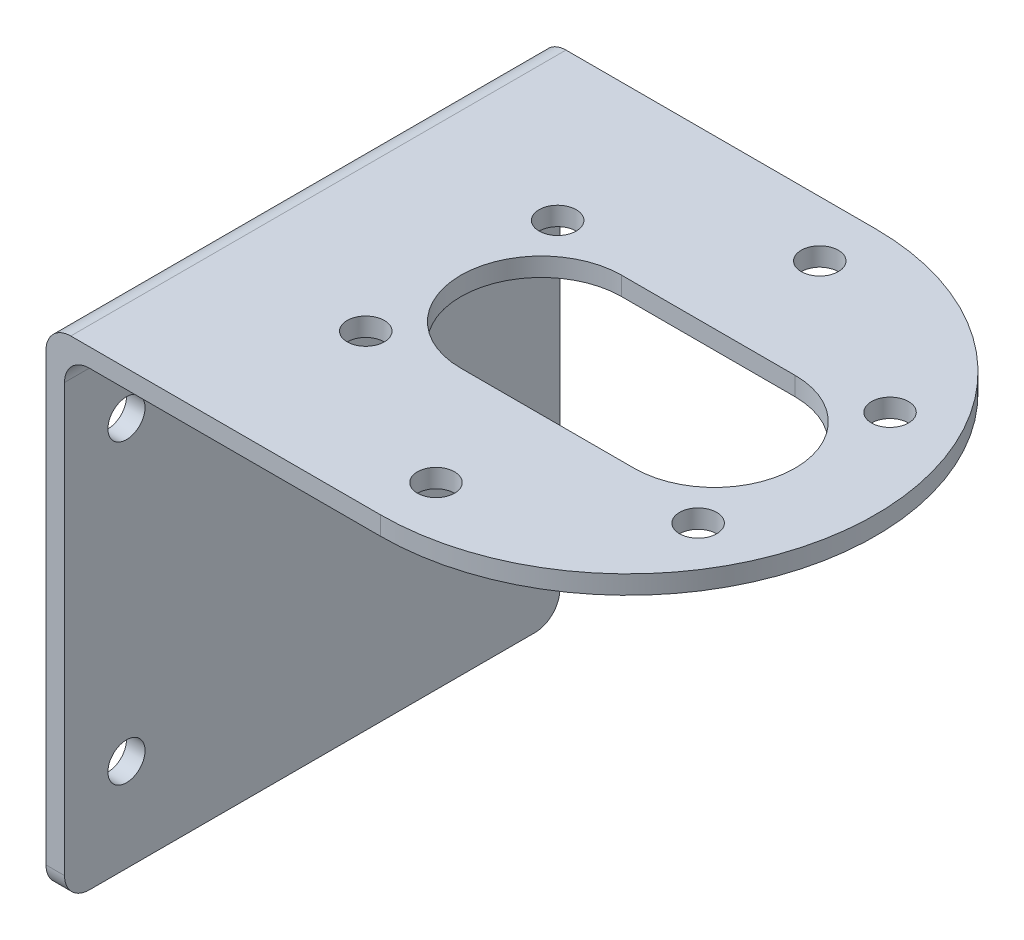
ISO-10303-21;
HEADER;
FILE_DESCRIPTION(('STEP AP214'),'2;1');
FILE_NAME('part.step','',(''),(''),'','','');
FILE_SCHEMA(('AUTOMOTIVE_DESIGN { 1 0 10303 214 1 1 1 1 }'));
ENDSEC;
DATA;
#1=APPLICATION_CONTEXT('core data for automotive mechanical design processes');
#2=APPLICATION_PROTOCOL_DEFINITION('international standard','automotive_design',2000,#1);
#3=PRODUCT_CONTEXT('',#1,'mechanical');
#4=PRODUCT('Part','Part','',(#3));
#5=PRODUCT_RELATED_PRODUCT_CATEGORY('part','',(#4));
#6=PRODUCT_DEFINITION_FORMATION('','',#4);
#7=PRODUCT_DEFINITION_CONTEXT('part definition',#1,'design');
#8=PRODUCT_DEFINITION('design','',#6,#7);
#9=PRODUCT_DEFINITION_SHAPE('','',#8);
#10=(LENGTH_UNIT() NAMED_UNIT(*) SI_UNIT(.MILLI.,.METRE.));
#11=(NAMED_UNIT(*) PLANE_ANGLE_UNIT() SI_UNIT($,.RADIAN.));
#12=(NAMED_UNIT(*) SI_UNIT($,.STERADIAN.) SOLID_ANGLE_UNIT());
#13=UNCERTAINTY_MEASURE_WITH_UNIT(LENGTH_MEASURE(1.E-05),#10,'distance_accuracy_value','');
#14=(GEOMETRIC_REPRESENTATION_CONTEXT(3) GLOBAL_UNCERTAINTY_ASSIGNED_CONTEXT((#13)) GLOBAL_UNIT_ASSIGNED_CONTEXT((#10,
#11,#12)) REPRESENTATION_CONTEXT('',''));
#15=CARTESIAN_POINT('',(0.,0.,0.));
#16=DIRECTION('',(0.,0.,1.));
#17=DIRECTION('',(1.,0.,0.));
#18=AXIS2_PLACEMENT_3D('',#15,#16,#17);
#19=CARTESIAN_POINT('',(3.5,-3.5,20.));
#20=DIRECTION('',(0.,0.,-1.));
#21=DIRECTION('',(-1.,0.,0.));
#22=AXIS2_PLACEMENT_3D('',#19,#20,#21);
#23=CYLINDRICAL_SURFACE('',#22,2.);
#24=CARTESIAN_POINT('',(3.5,-3.5,-20.));
#25=DIRECTION('',(0.,0.,-1.));
#26=DIRECTION('',(-1.,0.,0.));
#27=AXIS2_PLACEMENT_3D('',#24,#25,#26);
#28=CIRCLE('',#27,2.);
#29=CARTESIAN_POINT('',(1.5,-3.5,-20.));
#30=VERTEX_POINT('',#29);
#31=CARTESIAN_POINT('',(3.5,-1.5,-20.));
#32=VERTEX_POINT('',#31);
#33=EDGE_CURVE('E180',#30,#32,#28,.T.);
#34=ORIENTED_EDGE('',*,*,#33,.T.);
#35=DIRECTION('',(0.,0.,-1.));
#36=VECTOR('',#35,1.);
#37=CARTESIAN_POINT('',(3.5,-1.5,20.));
#38=LINE('',#37,#36);
#39=CARTESIAN_POINT('',(3.5,-1.5,20.));
#40=VERTEX_POINT('',#39);
#41=EDGE_CURVE('E226',#40,#32,#38,.T.);
#42=ORIENTED_EDGE('',*,*,#41,.F.);
#43=CARTESIAN_POINT('',(3.5,-3.5,20.));
#44=DIRECTION('',(0.,0.,-1.));
#45=DIRECTION('',(-1.,0.,0.));
#46=AXIS2_PLACEMENT_3D('',#43,#44,#45);
#47=CIRCLE('',#46,2.);
#48=CARTESIAN_POINT('',(1.5,-3.5,20.));
#49=VERTEX_POINT('',#48);
#50=EDGE_CURVE('E181',#49,#40,#47,.T.);
#51=ORIENTED_EDGE('',*,*,#50,.F.);
#52=DIRECTION('',(0.,0.,-1.));
#53=VECTOR('',#52,1.);
#54=CARTESIAN_POINT('',(1.5,-3.5,20.));
#55=LINE('',#54,#53);
#56=EDGE_CURVE('E198',#49,#30,#55,.T.);
#57=ORIENTED_EDGE('',*,*,#56,.T.);
#58=EDGE_LOOP('',(#34,#42,#51,#57));
#59=FACE_BOUND('',#58,.T.);
#60=ADVANCED_FACE('F34',(#59),#23,.F.);
#61=CARTESIAN_POINT('',(3.5,-1.5,20.));
#62=DIRECTION('',(0.,1.,0.));
#63=DIRECTION('',(0.,0.,1.));
#64=AXIS2_PLACEMENT_3D('',#61,#62,#63);
#65=PLANE('',#64);
#66=CARTESIAN_POINT('',(40.4233937586587,-1.5,-7.75000000000016));
#67=DIRECTION('',(0.,-1.,0.));
#68=DIRECTION('',(0.866025403784433,0.,-0.50000000000001));
#69=AXIS2_PLACEMENT_3D('',#66,#67,#68);
#70=CIRCLE('',#69,1.5);
#71=CARTESIAN_POINT('',(41.7224318643354,-1.5,-8.50000000000018));
#72=VERTEX_POINT('',#71);
#73=EDGE_CURVE('E293',#72,#72,#70,.T.);
#74=ORIENTED_EDGE('',*,*,#73,.F.);
#75=EDGE_LOOP('',(#74));
#76=FACE_BOUND('',#75,.T.);
#77=CARTESIAN_POINT('',(40.4233937586589,-1.5,7.74999999999987));
#78=DIRECTION('',(0.,-1.,0.));
#79=DIRECTION('',(0.866025403784443,0.,0.499999999999992));
#80=AXIS2_PLACEMENT_3D('',#77,#78,#79);
#81=CIRCLE('',#80,1.5);
#82=CARTESIAN_POINT('',(41.7224318643355,-1.5,8.49999999999986));
#83=VERTEX_POINT('',#82);
#84=EDGE_CURVE('E283',#83,#83,#81,.T.);
#85=ORIENTED_EDGE('',*,*,#84,.F.);
#86=EDGE_LOOP('',(#85));
#87=FACE_BOUND('',#86,.T.);
#88=CARTESIAN_POINT('',(27.,-1.5,15.5));
#89=DIRECTION('',(0.,-1.,0.));
#90=DIRECTION('',(0.,0.,1.));
#91=AXIS2_PLACEMENT_3D('',#88,#89,#90);
#92=CIRCLE('',#91,1.5);
#93=CARTESIAN_POINT('',(27.,-1.5,17.));
#94=VERTEX_POINT('',#93);
#95=EDGE_CURVE('E280',#94,#94,#92,.T.);
#96=ORIENTED_EDGE('',*,*,#95,.F.);
#97=EDGE_LOOP('',(#96));
#98=FACE_BOUND('',#97,.T.);
#99=CARTESIAN_POINT('',(13.5766062413412,-1.5,7.75000000000007));
#100=DIRECTION('',(0.,-1.,0.));
#101=DIRECTION('',(-0.866025403784436,0.,0.500000000000004));
#102=AXIS2_PLACEMENT_3D('',#99,#100,#101);
#103=CIRCLE('',#102,1.5);
#104=CARTESIAN_POINT('',(12.2775681356646,-1.5,8.50000000000007));
#105=VERTEX_POINT('',#104);
#106=EDGE_CURVE('E277',#105,#105,#103,.T.);
#107=ORIENTED_EDGE('',*,*,#106,.F.);
#108=EDGE_LOOP('',(#107));
#109=FACE_BOUND('',#108,.T.);
#110=CARTESIAN_POINT('',(13.5766062413412,-1.5,-7.74999999999997));
#111=DIRECTION('',(0.,-1.,0.));
#112=DIRECTION('',(-0.86602540378444,0.,-0.499999999999998));
#113=AXIS2_PLACEMENT_3D('',#110,#111,#112);
#114=CIRCLE('',#113,1.5);
#115=CARTESIAN_POINT('',(12.2775681356645,-1.5,-8.49999999999996));
#116=VERTEX_POINT('',#115);
#117=EDGE_CURVE('E273',#116,#116,#114,.T.);
#118=ORIENTED_EDGE('',*,*,#117,.F.);
#119=EDGE_LOOP('',(#118));
#120=FACE_BOUND('',#119,.T.);
#121=CARTESIAN_POINT('',(27.,-1.5,-15.5));
#122=DIRECTION('',(0.,-1.,0.));
#123=DIRECTION('',(0.,0.,-1.));
#124=AXIS2_PLACEMENT_3D('',#121,#122,#123);
#125=CIRCLE('',#124,1.5);
#126=CARTESIAN_POINT('',(27.,-1.5,-17.));
#127=VERTEX_POINT('',#126);
#128=EDGE_CURVE('E242',#127,#127,#125,.T.);
#129=ORIENTED_EDGE('',*,*,#128,.F.);
#130=EDGE_LOOP('',(#129));
#131=FACE_BOUND('',#130,.T.);
#132=DIRECTION('',(-1.,0.,0.));
#133=VECTOR('',#132,1.);
#134=CARTESIAN_POINT('',(34.,-1.5,6.5));
#135=LINE('',#134,#133);
#136=CARTESIAN_POINT('',(34.,-1.5,6.5));
#137=VERTEX_POINT('',#136);
#138=CARTESIAN_POINT('',(20.,-1.5,6.5));
#139=VERTEX_POINT('',#138);
#140=EDGE_CURVE('E155',#137,#139,#135,.T.);
#141=ORIENTED_EDGE('',*,*,#140,.F.);
#142=CARTESIAN_POINT('',(34.,-1.5,0.));
#143=DIRECTION('',(0.,-1.,0.));
#144=DIRECTION('',(0.,0.,-1.));
#145=AXIS2_PLACEMENT_3D('',#142,#143,#144);
#146=CIRCLE('',#145,6.5);
#147=CARTESIAN_POINT('',(34.,-1.5,-6.5));
#148=VERTEX_POINT('',#147);
#149=EDGE_CURVE('E160',#148,#137,#146,.T.);
#150=ORIENTED_EDGE('',*,*,#149,.F.);
#151=DIRECTION('',(1.,0.,0.));
#152=VECTOR('',#151,1.);
#153=CARTESIAN_POINT('',(34.,-1.5,-6.5));
#154=LINE('',#153,#152);
#155=CARTESIAN_POINT('',(20.,-1.5,-6.5));
#156=VERTEX_POINT('',#155);
#157=EDGE_CURVE('E165',#156,#148,#154,.T.);
#158=ORIENTED_EDGE('',*,*,#157,.F.);
#159=CARTESIAN_POINT('',(20.,-1.5,0.));
#160=DIRECTION('',(0.,-1.,0.));
#161=DIRECTION('',(0.,0.,-1.));
#162=AXIS2_PLACEMENT_3D('',#159,#160,#161);
#163=CIRCLE('',#162,6.5);
#164=EDGE_CURVE('E144',#139,#156,#163,.T.);
#165=ORIENTED_EDGE('',*,*,#164,.F.);
#166=EDGE_LOOP('',(#141,#150,#158,#165));
#167=FACE_BOUND('',#166,.T.);
#168=DIRECTION('',(1.,0.,0.));
#169=VECTOR('',#168,1.);
#170=CARTESIAN_POINT('',(3.5,-1.5,-20.));
#171=LINE('',#170,#169);
#172=CARTESIAN_POINT('',(27.,-1.5,-20.));
#173=VERTEX_POINT('',#172);
#174=EDGE_CURVE('E201',#32,#173,#171,.T.);
#175=ORIENTED_EDGE('',*,*,#174,.T.);
#176=CARTESIAN_POINT('',(27.,-1.5,0.));
#177=DIRECTION('',(0.,1.,0.));
#178=DIRECTION('',(0.,0.,1.));
#179=AXIS2_PLACEMENT_3D('',#176,#177,#178);
#180=CIRCLE('',#179,20.);
#181=CARTESIAN_POINT('',(27.,-1.5,20.));
#182=VERTEX_POINT('',#181);
#183=EDGE_CURVE('E172',#182,#173,#180,.T.);
#184=ORIENTED_EDGE('',*,*,#183,.F.);
#185=DIRECTION('',(1.,0.,0.));
#186=VECTOR('',#185,1.);
#187=CARTESIAN_POINT('',(3.5,-1.5,20.));
#188=LINE('',#187,#186);
#189=EDGE_CURVE('E184',#40,#182,#188,.T.);
#190=ORIENTED_EDGE('',*,*,#189,.F.);
#191=ORIENTED_EDGE('',*,*,#41,.T.);
#192=EDGE_LOOP('',(#175,#184,#190,#191));
#193=FACE_BOUND('',#192,.T.);
#194=ADVANCED_FACE('F162',(#76,#87,#98,#109,#120,#131,#167,#193),#65,.F.);
#195=CARTESIAN_POINT('',(2.00000000000001,0.,20.));
#196=DIRECTION('',(0.,1.,0.));
#197=DIRECTION('',(0.,0.,1.));
#198=AXIS2_PLACEMENT_3D('',#195,#196,#197);
#199=PLANE('',#198);
#200=CARTESIAN_POINT('',(40.4233937586587,0.,-7.75000000000016));
#201=DIRECTION('',(0.,1.,0.));
#202=DIRECTION('',(0.,0.,1.));
#203=AXIS2_PLACEMENT_3D('',#200,#201,#202);
#204=CIRCLE('',#203,1.5);
#205=CARTESIAN_POINT('',(40.4233937586587,0.,-6.25000000000016));
#206=VERTEX_POINT('',#205);
#207=EDGE_CURVE('E38',#206,#206,#204,.T.);
#208=ORIENTED_EDGE('',*,*,#207,.F.);
#209=EDGE_LOOP('',(#208));
#210=FACE_BOUND('',#209,.T.);
#211=CARTESIAN_POINT('',(40.4233937586589,0.,7.74999999999987));
#212=DIRECTION('',(0.,1.,0.));
#213=DIRECTION('',(0.,0.,1.));
#214=AXIS2_PLACEMENT_3D('',#211,#212,#213);
#215=CIRCLE('',#214,1.5);
#216=CARTESIAN_POINT('',(40.4233937586589,0.,9.24999999999987));
#217=VERTEX_POINT('',#216);
#218=EDGE_CURVE('E281',#217,#217,#215,.T.);
#219=ORIENTED_EDGE('',*,*,#218,.F.);
#220=EDGE_LOOP('',(#219));
#221=FACE_BOUND('',#220,.T.);
#222=CARTESIAN_POINT('',(27.,0.,15.5));
#223=DIRECTION('',(0.,1.,0.));
#224=DIRECTION('',(0.,0.,1.));
#225=AXIS2_PLACEMENT_3D('',#222,#223,#224);
#226=CIRCLE('',#225,1.5);
#227=CARTESIAN_POINT('',(27.,0.,17.));
#228=VERTEX_POINT('',#227);
#229=EDGE_CURVE('E278',#228,#228,#226,.T.);
#230=ORIENTED_EDGE('',*,*,#229,.F.);
#231=EDGE_LOOP('',(#230));
#232=FACE_BOUND('',#231,.T.);
#233=CARTESIAN_POINT('',(13.5766062413412,0.,7.75000000000007));
#234=DIRECTION('',(0.,1.,0.));
#235=DIRECTION('',(0.,0.,1.));
#236=AXIS2_PLACEMENT_3D('',#233,#234,#235);
#237=CIRCLE('',#236,1.5);
#238=CARTESIAN_POINT('',(13.5766062413412,0.,9.25000000000007));
#239=VERTEX_POINT('',#238);
#240=EDGE_CURVE('E274',#239,#239,#237,.T.);
#241=ORIENTED_EDGE('',*,*,#240,.F.);
#242=EDGE_LOOP('',(#241));
#243=FACE_BOUND('',#242,.T.);
#244=CARTESIAN_POINT('',(13.5766062413412,0.,-7.74999999999997));
#245=DIRECTION('',(0.,1.,0.));
#246=DIRECTION('',(0.,0.,1.));
#247=AXIS2_PLACEMENT_3D('',#244,#245,#246);
#248=CIRCLE('',#247,1.5);
#249=CARTESIAN_POINT('',(13.5766062413412,0.,-6.24999999999996));
#250=VERTEX_POINT('',#249);
#251=EDGE_CURVE('E270',#250,#250,#248,.T.);
#252=ORIENTED_EDGE('',*,*,#251,.F.);
#253=EDGE_LOOP('',(#252));
#254=FACE_BOUND('',#253,.T.);
#255=CARTESIAN_POINT('',(27.,0.,-15.5));
#256=DIRECTION('',(0.,1.,0.));
#257=DIRECTION('',(0.,0.,1.));
#258=AXIS2_PLACEMENT_3D('',#255,#256,#257);
#259=CIRCLE('',#258,1.5);
#260=CARTESIAN_POINT('',(27.,0.,-14.));
#261=VERTEX_POINT('',#260);
#262=EDGE_CURVE('E239',#261,#261,#259,.T.);
#263=ORIENTED_EDGE('',*,*,#262,.F.);
#264=EDGE_LOOP('',(#263));
#265=FACE_BOUND('',#264,.T.);
#266=CARTESIAN_POINT('',(34.,0.,0.));
#267=DIRECTION('',(0.,1.,0.));
#268=DIRECTION('',(0.,0.,1.));
#269=AXIS2_PLACEMENT_3D('',#266,#267,#268);
#270=CIRCLE('',#269,6.5);
#271=CARTESIAN_POINT('',(34.,0.,6.5));
#272=VERTEX_POINT('',#271);
#273=CARTESIAN_POINT('',(34.,0.,-6.5));
#274=VERTEX_POINT('',#273);
#275=EDGE_CURVE('E236',#272,#274,#270,.T.);
#276=ORIENTED_EDGE('',*,*,#275,.F.);
#277=DIRECTION('',(1.,0.,0.));
#278=VECTOR('',#277,1.);
#279=CARTESIAN_POINT('',(2.00000000000002,0.,6.5));
#280=LINE('',#279,#278);
#281=CARTESIAN_POINT('',(20.,0.,6.5));
#282=VERTEX_POINT('',#281);
#283=EDGE_CURVE('E231',#282,#272,#280,.T.);
#284=ORIENTED_EDGE('',*,*,#283,.F.);
#285=CARTESIAN_POINT('',(20.,0.,0.));
#286=DIRECTION('',(0.,1.,0.));
#287=DIRECTION('',(0.,0.,1.));
#288=AXIS2_PLACEMENT_3D('',#285,#286,#287);
#289=CIRCLE('',#288,6.5);
#290=CARTESIAN_POINT('',(20.,0.,-6.5));
#291=VERTEX_POINT('',#290);
#292=EDGE_CURVE('E147',#291,#282,#289,.T.);
#293=ORIENTED_EDGE('',*,*,#292,.F.);
#294=DIRECTION('',(-1.,0.,0.));
#295=VECTOR('',#294,1.);
#296=CARTESIAN_POINT('',(2.00000000000002,0.,-6.5));
#297=LINE('',#296,#295);
#298=EDGE_CURVE('E234',#274,#291,#297,.T.);
#299=ORIENTED_EDGE('',*,*,#298,.F.);
#300=EDGE_LOOP('',(#276,#284,#293,#299));
#301=FACE_BOUND('',#300,.T.);
#302=CARTESIAN_POINT('',(27.,0.,0.));
#303=DIRECTION('',(0.,1.,0.));
#304=DIRECTION('',(0.,0.,1.));
#305=AXIS2_PLACEMENT_3D('',#302,#303,#304);
#306=CIRCLE('',#305,20.);
#307=CARTESIAN_POINT('',(27.,0.,-20.));
#308=VERTEX_POINT('',#307);
#309=CARTESIAN_POINT('',(27.,0.,20.));
#310=VERTEX_POINT('',#309);
#311=EDGE_CURVE('E178',#308,#310,#306,.F.);
#312=ORIENTED_EDGE('',*,*,#311,.F.);
#313=DIRECTION('',(1.,0.,0.));
#314=VECTOR('',#313,1.);
#315=CARTESIAN_POINT('',(2.00000000000001,0.,-20.));
#316=LINE('',#315,#314);
#317=CARTESIAN_POINT('',(2.00000000000001,0.,-20.));
#318=VERTEX_POINT('',#317);
#319=EDGE_CURVE('E204',#318,#308,#316,.T.);
#320=ORIENTED_EDGE('',*,*,#319,.F.);
#321=DIRECTION('',(0.,0.,-1.));
#322=VECTOR('',#321,1.);
#323=CARTESIAN_POINT('',(2.00000000000001,0.,20.));
#324=LINE('',#323,#322);
#325=CARTESIAN_POINT('',(2.00000000000001,0.,20.));
#326=VERTEX_POINT('',#325);
#327=EDGE_CURVE('E224',#326,#318,#324,.T.);
#328=ORIENTED_EDGE('',*,*,#327,.F.);
#329=DIRECTION('',(1.,0.,0.));
#330=VECTOR('',#329,1.);
#331=CARTESIAN_POINT('',(2.00000000000001,0.,20.));
#332=LINE('',#331,#330);
#333=EDGE_CURVE('E188',#326,#310,#332,.T.);
#334=ORIENTED_EDGE('',*,*,#333,.T.);
#335=EDGE_LOOP('',(#312,#320,#328,#334));
#336=FACE_BOUND('',#335,.T.);
#337=ADVANCED_FACE('F317',(#210,#221,#232,#243,#254,#265,#301,#336),#199,.T.);
#338=CARTESIAN_POINT('',(2.,-2.,20.));
#339=DIRECTION('',(0.,0.,-1.));
#340=DIRECTION('',(-1.,0.,0.));
#341=AXIS2_PLACEMENT_3D('',#338,#339,#340);
#342=CYLINDRICAL_SURFACE('',#341,2.);
#343=CARTESIAN_POINT('',(2.,-2.,-20.));
#344=DIRECTION('',(0.,0.,-1.));
#345=DIRECTION('',(-1.,0.,0.));
#346=AXIS2_PLACEMENT_3D('',#343,#344,#345);
#347=CIRCLE('',#346,2.);
#348=CARTESIAN_POINT('',(0.,-2.00000000000001,-20.));
#349=VERTEX_POINT('',#348);
#350=EDGE_CURVE('E207',#349,#318,#347,.T.);
#351=ORIENTED_EDGE('',*,*,#350,.F.);
#352=DIRECTION('',(0.,0.,-1.));
#353=VECTOR('',#352,1.);
#354=CARTESIAN_POINT('',(0.,-2.00000000000001,20.));
#355=LINE('',#354,#353);
#356=CARTESIAN_POINT('',(0.,-2.00000000000001,20.));
#357=VERTEX_POINT('',#356);
#358=EDGE_CURVE('E221',#357,#349,#355,.T.);
#359=ORIENTED_EDGE('',*,*,#358,.F.);
#360=CARTESIAN_POINT('',(2.,-2.,20.));
#361=DIRECTION('',(0.,0.,-1.));
#362=DIRECTION('',(-1.,0.,0.));
#363=AXIS2_PLACEMENT_3D('',#360,#361,#362);
#364=CIRCLE('',#363,2.);
#365=EDGE_CURVE('E191',#357,#326,#364,.T.);
#366=ORIENTED_EDGE('',*,*,#365,.T.);
#367=ORIENTED_EDGE('',*,*,#327,.T.);
#368=EDGE_LOOP('',(#351,#359,#366,#367));
#369=FACE_BOUND('',#368,.T.);
#370=ADVANCED_FACE('F320',(#369),#342,.T.);
#371=CARTESIAN_POINT('',(0.,-40.,20.));
#372=DIRECTION('',(-1.,0.,0.));
#373=DIRECTION('',(0.,0.,1.));
#374=AXIS2_PLACEMENT_3D('',#371,#372,#373);
#375=PLANE('',#374);
#376=CARTESIAN_POINT('',(0.,-8.5,-15.));
#377=DIRECTION('',(-1.,0.,0.));
#378=DIRECTION('',(0.,0.,-1.));
#379=AXIS2_PLACEMENT_3D('',#376,#377,#378);
#380=CIRCLE('',#379,1.49999999999999);
#381=CARTESIAN_POINT('',(0.,-8.5,-16.5));
#382=VERTEX_POINT('',#381);
#383=EDGE_CURVE('E258',#382,#382,#380,.T.);
#384=ORIENTED_EDGE('',*,*,#383,.F.);
#385=EDGE_LOOP('',(#384));
#386=FACE_BOUND('',#385,.T.);
#387=CARTESIAN_POINT('',(0.,-32.5,-15.));
#388=DIRECTION('',(-1.,0.,0.));
#389=DIRECTION('',(0.,0.,-1.));
#390=AXIS2_PLACEMENT_3D('',#387,#388,#389);
#391=CIRCLE('',#390,1.5);
#392=CARTESIAN_POINT('',(0.,-32.5,-16.5));
#393=VERTEX_POINT('',#392);
#394=EDGE_CURVE('E254',#393,#393,#391,.T.);
#395=ORIENTED_EDGE('',*,*,#394,.F.);
#396=EDGE_LOOP('',(#395));
#397=FACE_BOUND('',#396,.T.);
#398=CARTESIAN_POINT('',(0.,-32.5,15.));
#399=DIRECTION('',(-1.,0.,0.));
#400=DIRECTION('',(0.,0.,1.));
#401=AXIS2_PLACEMENT_3D('',#398,#399,#400);
#402=CIRCLE('',#401,1.49999999999999);
#403=CARTESIAN_POINT('',(0.,-32.5,16.5));
#404=VERTEX_POINT('',#403);
#405=EDGE_CURVE('E250',#404,#404,#402,.T.);
#406=ORIENTED_EDGE('',*,*,#405,.F.);
#407=EDGE_LOOP('',(#406));
#408=FACE_BOUND('',#407,.T.);
#409=CARTESIAN_POINT('',(0.,-8.49999999999999,15.));
#410=DIRECTION('',(-1.,0.,0.));
#411=DIRECTION('',(0.,0.,1.));
#412=AXIS2_PLACEMENT_3D('',#409,#410,#411);
#413=CIRCLE('',#412,1.49999999999999);
#414=CARTESIAN_POINT('',(0.,-8.49999999999999,16.5));
#415=VERTEX_POINT('',#414);
#416=EDGE_CURVE('E246',#415,#415,#413,.T.);
#417=ORIENTED_EDGE('',*,*,#416,.F.);
#418=EDGE_LOOP('',(#417));
#419=FACE_BOUND('',#418,.T.);
#420=DIRECTION('',(0.,1.,0.));
#421=VECTOR('',#420,1.);
#422=CARTESIAN_POINT('',(0.,-40.,-20.));
#423=LINE('',#422,#421);
#424=CARTESIAN_POINT('',(0.,-38.,-20.));
#425=VERTEX_POINT('',#424);
#426=EDGE_CURVE('E210',#425,#349,#423,.T.);
#427=ORIENTED_EDGE('',*,*,#426,.F.);
#428=CARTESIAN_POINT('',(0.,-38.,-18.));
#429=DIRECTION('',(-1.,0.,0.));
#430=DIRECTION('',(0.,0.,1.));
#431=AXIS2_PLACEMENT_3D('',#428,#429,#430);
#432=CIRCLE('',#431,2.);
#433=CARTESIAN_POINT('',(0.,-40.,-18.));
#434=VERTEX_POINT('',#433);
#435=EDGE_CURVE('E43',#425,#434,#432,.T.);
#436=ORIENTED_EDGE('',*,*,#435,.T.);
#437=DIRECTION('',(0.,0.,-1.));
#438=VECTOR('',#437,1.);
#439=CARTESIAN_POINT('',(0.,-40.,20.));
#440=LINE('',#439,#438);
#441=CARTESIAN_POINT('',(0.,-40.,18.));
#442=VERTEX_POINT('',#441);
#443=EDGE_CURVE('E218',#442,#434,#440,.T.);
#444=ORIENTED_EDGE('',*,*,#443,.F.);
#445=CARTESIAN_POINT('',(0.,-38.,18.));
#446=DIRECTION('',(-1.,0.,0.));
#447=DIRECTION('',(0.,0.,1.));
#448=AXIS2_PLACEMENT_3D('',#445,#446,#447);
#449=CIRCLE('',#448,2.);
#450=CARTESIAN_POINT('',(0.,-38.,20.));
#451=VERTEX_POINT('',#450);
#452=EDGE_CURVE('E51',#442,#451,#449,.T.);
#453=ORIENTED_EDGE('',*,*,#452,.T.);
#454=DIRECTION('',(0.,1.,0.));
#455=VECTOR('',#454,1.);
#456=CARTESIAN_POINT('',(0.,-40.,20.));
#457=LINE('',#456,#455);
#458=EDGE_CURVE('E194',#451,#357,#457,.T.);
#459=ORIENTED_EDGE('',*,*,#458,.T.);
#460=ORIENTED_EDGE('',*,*,#358,.T.);
#461=EDGE_LOOP('',(#427,#436,#444,#453,#459,#460));
#462=FACE_BOUND('',#461,.T.);
#463=ADVANCED_FACE('F354',(#386,#397,#408,#419,#462),#375,.T.);
#464=CARTESIAN_POINT('',(0.,-40.,20.));
#465=DIRECTION('',(0.,1.,0.));
#466=DIRECTION('',(0.,0.,1.));
#467=AXIS2_PLACEMENT_3D('',#464,#465,#466);
#468=PLANE('',#467);
#469=ORIENTED_EDGE('',*,*,#443,.T.);
#470=DIRECTION('',(1.,0.,0.));
#471=VECTOR('',#470,1.);
#472=CARTESIAN_POINT('',(1.5,-40.,-18.));
#473=LINE('',#472,#471);
#474=CARTESIAN_POINT('',(1.5,-40.,-18.));
#475=VERTEX_POINT('',#474);
#476=EDGE_CURVE('E260',#434,#475,#473,.T.);
#477=ORIENTED_EDGE('',*,*,#476,.T.);
#478=DIRECTION('',(0.,0.,-1.));
#479=VECTOR('',#478,1.);
#480=CARTESIAN_POINT('',(1.5,-40.,20.));
#481=LINE('',#480,#479);
#482=CARTESIAN_POINT('',(1.5,-40.,18.));
#483=VERTEX_POINT('',#482);
#484=EDGE_CURVE('E215',#483,#475,#481,.T.);
#485=ORIENTED_EDGE('',*,*,#484,.F.);
#486=DIRECTION('',(1.,0.,0.));
#487=VECTOR('',#486,1.);
#488=CARTESIAN_POINT('',(0.,-40.,18.));
#489=LINE('',#488,#487);
#490=EDGE_CURVE('E238',#483,#442,#489,.F.);
#491=ORIENTED_EDGE('',*,*,#490,.T.);
#492=EDGE_LOOP('',(#469,#477,#485,#491));
#493=FACE_BOUND('',#492,.T.);
#494=ADVANCED_FACE('F352',(#493),#468,.F.);
#495=CARTESIAN_POINT('',(1.5,-40.,20.));
#496=DIRECTION('',(-1.,0.,0.));
#497=DIRECTION('',(0.,0.,1.));
#498=AXIS2_PLACEMENT_3D('',#495,#496,#497);
#499=PLANE('',#498);
#500=CARTESIAN_POINT('',(1.5,-8.5,-15.));
#501=DIRECTION('',(-1.,0.,0.));
#502=DIRECTION('',(0.,0.,1.));
#503=AXIS2_PLACEMENT_3D('',#500,#501,#502);
#504=CIRCLE('',#503,1.49999999999999);
#505=CARTESIAN_POINT('',(1.5,-8.5,-13.5));
#506=VERTEX_POINT('',#505);
#507=EDGE_CURVE('E255',#506,#506,#504,.T.);
#508=ORIENTED_EDGE('',*,*,#507,.T.);
#509=EDGE_LOOP('',(#508));
#510=FACE_BOUND('',#509,.T.);
#511=CARTESIAN_POINT('',(1.5,-32.5,-15.));
#512=DIRECTION('',(-1.,0.,0.));
#513=DIRECTION('',(0.,0.,1.));
#514=AXIS2_PLACEMENT_3D('',#511,#512,#513);
#515=CIRCLE('',#514,1.5);
#516=CARTESIAN_POINT('',(1.5,-32.5,-13.5));
#517=VERTEX_POINT('',#516);
#518=EDGE_CURVE('E251',#517,#517,#515,.T.);
#519=ORIENTED_EDGE('',*,*,#518,.T.);
#520=EDGE_LOOP('',(#519));
#521=FACE_BOUND('',#520,.T.);
#522=CARTESIAN_POINT('',(1.5,-32.5,15.));
#523=DIRECTION('',(-1.,0.,0.));
#524=DIRECTION('',(0.,0.,1.));
#525=AXIS2_PLACEMENT_3D('',#522,#523,#524);
#526=CIRCLE('',#525,1.49999999999999);
#527=CARTESIAN_POINT('',(1.5,-32.5,16.5));
#528=VERTEX_POINT('',#527);
#529=EDGE_CURVE('E247',#528,#528,#526,.T.);
#530=ORIENTED_EDGE('',*,*,#529,.T.);
#531=EDGE_LOOP('',(#530));
#532=FACE_BOUND('',#531,.T.);
#533=CARTESIAN_POINT('',(1.5,-8.49999999999999,15.));
#534=DIRECTION('',(-1.,0.,0.));
#535=DIRECTION('',(0.,0.,1.));
#536=AXIS2_PLACEMENT_3D('',#533,#534,#535);
#537=CIRCLE('',#536,1.49999999999999);
#538=CARTESIAN_POINT('',(1.5,-8.49999999999999,16.5));
#539=VERTEX_POINT('',#538);
#540=EDGE_CURVE('E243',#539,#539,#537,.T.);
#541=ORIENTED_EDGE('',*,*,#540,.T.);
#542=EDGE_LOOP('',(#541));
#543=FACE_BOUND('',#542,.T.);
#544=ORIENTED_EDGE('',*,*,#484,.T.);
#545=CARTESIAN_POINT('',(1.5,-38.,-18.));
#546=DIRECTION('',(-1.,0.,0.));
#547=DIRECTION('',(0.,0.,1.));
#548=AXIS2_PLACEMENT_3D('',#545,#546,#547);
#549=CIRCLE('',#548,2.);
#550=CARTESIAN_POINT('',(1.5,-38.,-20.));
#551=VERTEX_POINT('',#550);
#552=EDGE_CURVE('E265',#475,#551,#549,.F.);
#553=ORIENTED_EDGE('',*,*,#552,.T.);
#554=DIRECTION('',(0.,1.,0.));
#555=VECTOR('',#554,1.);
#556=CARTESIAN_POINT('',(1.5,-40.,-20.));
#557=LINE('',#556,#555);
#558=EDGE_CURVE('E185',#551,#30,#557,.T.);
#559=ORIENTED_EDGE('',*,*,#558,.T.);
#560=ORIENTED_EDGE('',*,*,#56,.F.);
#561=DIRECTION('',(0.,1.,0.));
#562=VECTOR('',#561,1.);
#563=CARTESIAN_POINT('',(1.5,-40.,20.));
#564=LINE('',#563,#562);
#565=CARTESIAN_POINT('',(1.5,-38.,20.));
#566=VERTEX_POINT('',#565);
#567=EDGE_CURVE('E196',#566,#49,#564,.T.);
#568=ORIENTED_EDGE('',*,*,#567,.F.);
#569=CARTESIAN_POINT('',(1.5,-38.,18.));
#570=DIRECTION('',(-1.,0.,0.));
#571=DIRECTION('',(0.,0.,1.));
#572=AXIS2_PLACEMENT_3D('',#569,#570,#571);
#573=CIRCLE('',#572,2.);
#574=EDGE_CURVE('E263',#566,#483,#573,.F.);
#575=ORIENTED_EDGE('',*,*,#574,.T.);
#576=EDGE_LOOP('',(#544,#553,#559,#560,#568,#575));
#577=FACE_BOUND('',#576,.T.);
#578=ADVANCED_FACE('F345',(#510,#521,#532,#543,#577),#499,.F.);
#579=CARTESIAN_POINT('',(3.5,-3.5,20.));
#580=DIRECTION('',(0.,0.,-1.));
#581=DIRECTION('',(-1.,0.,0.));
#582=AXIS2_PLACEMENT_3D('',#579,#580,#581);
#583=PLANE('',#582);
#584=ORIENTED_EDGE('',*,*,#458,.F.);
#585=DIRECTION('',(1.,0.,0.));
#586=VECTOR('',#585,1.);
#587=CARTESIAN_POINT('',(3.5,-38.,20.));
#588=LINE('',#587,#586);
#589=EDGE_CURVE('E11',#451,#566,#588,.T.);
#590=ORIENTED_EDGE('',*,*,#589,.T.);
#591=ORIENTED_EDGE('',*,*,#567,.T.);
#592=ORIENTED_EDGE('',*,*,#50,.T.);
#593=ORIENTED_EDGE('',*,*,#189,.T.);
#594=DIRECTION('',(0.,-1.,0.));
#595=VECTOR('',#594,1.);
#596=CARTESIAN_POINT('',(27.,38.5,20.));
#597=LINE('',#596,#595);
#598=EDGE_CURVE('E176',#310,#182,#597,.T.);
#599=ORIENTED_EDGE('',*,*,#598,.F.);
#600=ORIENTED_EDGE('',*,*,#333,.F.);
#601=ORIENTED_EDGE('',*,*,#365,.F.);
#602=EDGE_LOOP('',(#584,#590,#591,#592,#593,#599,#600,#601));
#603=FACE_BOUND('',#602,.T.);
#604=ADVANCED_FACE('F335',(#603),#583,.F.);
#605=CARTESIAN_POINT('',(3.5,-3.5,-20.));
#606=DIRECTION('',(0.,0.,-1.));
#607=DIRECTION('',(-1.,0.,0.));
#608=AXIS2_PLACEMENT_3D('',#605,#606,#607);
#609=PLANE('',#608);
#610=ORIENTED_EDGE('',*,*,#558,.F.);
#611=DIRECTION('',(1.,0.,0.));
#612=VECTOR('',#611,1.);
#613=CARTESIAN_POINT('',(0.,-38.,-20.));
#614=LINE('',#613,#612);
#615=EDGE_CURVE('E59',#551,#425,#614,.F.);
#616=ORIENTED_EDGE('',*,*,#615,.T.);
#617=ORIENTED_EDGE('',*,*,#426,.T.);
#618=ORIENTED_EDGE('',*,*,#350,.T.);
#619=ORIENTED_EDGE('',*,*,#319,.T.);
#620=DIRECTION('',(0.,-1.,0.));
#621=VECTOR('',#620,1.);
#622=CARTESIAN_POINT('',(27.,38.5,-20.));
#623=LINE('',#622,#621);
#624=EDGE_CURVE('E229',#173,#308,#623,.F.);
#625=ORIENTED_EDGE('',*,*,#624,.F.);
#626=ORIENTED_EDGE('',*,*,#174,.F.);
#627=ORIENTED_EDGE('',*,*,#33,.F.);
#628=EDGE_LOOP('',(#610,#616,#617,#618,#619,#625,#626,#627));
#629=FACE_BOUND('',#628,.T.);
#630=ADVANCED_FACE('F329',(#629),#609,.T.);
#631=CARTESIAN_POINT('',(27.,38.5,0.));
#632=DIRECTION('',(0.,-1.,0.));
#633=DIRECTION('',(0.,0.,-1.));
#634=AXIS2_PLACEMENT_3D('',#631,#632,#633);
#635=CYLINDRICAL_SURFACE('',#634,20.);
#636=ORIENTED_EDGE('',*,*,#311,.T.);
#637=ORIENTED_EDGE('',*,*,#598,.T.);
#638=ORIENTED_EDGE('',*,*,#183,.T.);
#639=ORIENTED_EDGE('',*,*,#624,.T.);
#640=EDGE_LOOP('',(#636,#637,#638,#639));
#641=FACE_BOUND('',#640,.T.);
#642=ADVANCED_FACE('F337',(#641),#635,.T.);
#643=CARTESIAN_POINT('',(34.,38.5,0.));
#644=DIRECTION('',(0.,-1.,0.));
#645=DIRECTION('',(0.,0.,-1.));
#646=AXIS2_PLACEMENT_3D('',#643,#644,#645);
#647=CYLINDRICAL_SURFACE('',#646,6.5);
#648=ORIENTED_EDGE('',*,*,#275,.T.);
#649=DIRECTION('',(0.,-1.,0.));
#650=VECTOR('',#649,1.);
#651=CARTESIAN_POINT('',(34.,38.5,-6.5));
#652=LINE('',#651,#650);
#653=EDGE_CURVE('E170',#274,#148,#652,.T.);
#654=ORIENTED_EDGE('',*,*,#653,.T.);
#655=ORIENTED_EDGE('',*,*,#149,.T.);
#656=DIRECTION('',(0.,-1.,0.));
#657=VECTOR('',#656,1.);
#658=CARTESIAN_POINT('',(34.,38.5,6.5));
#659=LINE('',#658,#657);
#660=EDGE_CURVE('E151',#272,#137,#659,.T.);
#661=ORIENTED_EDGE('',*,*,#660,.F.);
#662=EDGE_LOOP('',(#648,#654,#655,#661));
#663=FACE_BOUND('',#662,.T.);
#664=ADVANCED_FACE('F310',(#663),#647,.F.);
#665=CARTESIAN_POINT('',(34.,38.5,-6.5));
#666=DIRECTION('',(0.,0.,-1.));
#667=DIRECTION('',(-1.,0.,0.));
#668=AXIS2_PLACEMENT_3D('',#665,#666,#667);
#669=PLANE('',#668);
#670=ORIENTED_EDGE('',*,*,#298,.T.);
#671=DIRECTION('',(0.,-1.,0.));
#672=VECTOR('',#671,1.);
#673=CARTESIAN_POINT('',(20.,38.5,-6.5));
#674=LINE('',#673,#672);
#675=EDGE_CURVE('E150',#291,#156,#674,.T.);
#676=ORIENTED_EDGE('',*,*,#675,.T.);
#677=ORIENTED_EDGE('',*,*,#157,.T.);
#678=ORIENTED_EDGE('',*,*,#653,.F.);
#679=EDGE_LOOP('',(#670,#676,#677,#678));
#680=FACE_BOUND('',#679,.T.);
#681=ADVANCED_FACE('F315',(#680),#669,.F.);
#682=CARTESIAN_POINT('',(20.,38.5,0.));
#683=DIRECTION('',(0.,-1.,0.));
#684=DIRECTION('',(0.,0.,-1.));
#685=AXIS2_PLACEMENT_3D('',#682,#683,#684);
#686=CYLINDRICAL_SURFACE('',#685,6.5);
#687=ORIENTED_EDGE('',*,*,#292,.T.);
#688=DIRECTION('',(0.,-1.,0.));
#689=VECTOR('',#688,1.);
#690=CARTESIAN_POINT('',(20.,38.5,6.5));
#691=LINE('',#690,#689);
#692=EDGE_CURVE('E139',#282,#139,#691,.T.);
#693=ORIENTED_EDGE('',*,*,#692,.T.);
#694=ORIENTED_EDGE('',*,*,#164,.T.);
#695=ORIENTED_EDGE('',*,*,#675,.F.);
#696=EDGE_LOOP('',(#687,#693,#694,#695));
#697=FACE_BOUND('',#696,.T.);
#698=ADVANCED_FACE('F141',(#697),#686,.F.);
#699=CARTESIAN_POINT('',(34.,38.5,6.5));
#700=DIRECTION('',(0.,0.,1.));
#701=DIRECTION('',(1.,0.,0.));
#702=AXIS2_PLACEMENT_3D('',#699,#700,#701);
#703=PLANE('',#702);
#704=ORIENTED_EDGE('',*,*,#283,.T.);
#705=ORIENTED_EDGE('',*,*,#660,.T.);
#706=ORIENTED_EDGE('',*,*,#140,.T.);
#707=ORIENTED_EDGE('',*,*,#692,.F.);
#708=EDGE_LOOP('',(#704,#705,#706,#707));
#709=FACE_BOUND('',#708,.T.);
#710=ADVANCED_FACE('F156',(#709),#703,.F.);
#711=CARTESIAN_POINT('',(27.,38.5,-15.5));
#712=DIRECTION('',(0.,-1.,0.));
#713=DIRECTION('',(0.,0.,-1.));
#714=AXIS2_PLACEMENT_3D('',#711,#712,#713);
#715=CYLINDRICAL_SURFACE('',#714,1.5);
#716=ORIENTED_EDGE('',*,*,#262,.T.);
#717=EDGE_LOOP('',(#716));
#718=FACE_BOUND('',#717,.T.);
#719=ORIENTED_EDGE('',*,*,#128,.T.);
#720=EDGE_LOOP('',(#719));
#721=FACE_BOUND('',#720,.T.);
#722=ADVANCED_FACE('F395',(#718,#721),#715,.F.);
#723=CARTESIAN_POINT('',(40.,-8.49999999999999,15.));
#724=DIRECTION('',(-1.,0.,0.));
#725=DIRECTION('',(0.,0.,1.));
#726=AXIS2_PLACEMENT_3D('',#723,#724,#725);
#727=CYLINDRICAL_SURFACE('',#726,1.49999999999999);
#728=ORIENTED_EDGE('',*,*,#416,.T.);
#729=EDGE_LOOP('',(#728));
#730=FACE_BOUND('',#729,.T.);
#731=ORIENTED_EDGE('',*,*,#540,.F.);
#732=EDGE_LOOP('',(#731));
#733=FACE_BOUND('',#732,.T.);
#734=ADVANCED_FACE('F402',(#730,#733),#727,.F.);
#735=CARTESIAN_POINT('',(40.,-32.5,15.));
#736=DIRECTION('',(-1.,0.,0.));
#737=DIRECTION('',(0.,0.,1.));
#738=AXIS2_PLACEMENT_3D('',#735,#736,#737);
#739=CYLINDRICAL_SURFACE('',#738,1.49999999999999);
#740=ORIENTED_EDGE('',*,*,#405,.T.);
#741=EDGE_LOOP('',(#740));
#742=FACE_BOUND('',#741,.T.);
#743=ORIENTED_EDGE('',*,*,#529,.F.);
#744=EDGE_LOOP('',(#743));
#745=FACE_BOUND('',#744,.T.);
#746=ADVANCED_FACE('F406',(#742,#745),#739,.F.);
#747=CARTESIAN_POINT('',(40.,-32.5,-15.));
#748=DIRECTION('',(-1.,0.,0.));
#749=DIRECTION('',(0.,0.,1.));
#750=AXIS2_PLACEMENT_3D('',#747,#748,#749);
#751=CYLINDRICAL_SURFACE('',#750,1.5);
#752=ORIENTED_EDGE('',*,*,#394,.T.);
#753=EDGE_LOOP('',(#752));
#754=FACE_BOUND('',#753,.T.);
#755=ORIENTED_EDGE('',*,*,#518,.F.);
#756=EDGE_LOOP('',(#755));
#757=FACE_BOUND('',#756,.T.);
#758=ADVANCED_FACE('F410',(#754,#757),#751,.F.);
#759=CARTESIAN_POINT('',(40.,-8.5,-15.));
#760=DIRECTION('',(-1.,0.,0.));
#761=DIRECTION('',(0.,0.,1.));
#762=AXIS2_PLACEMENT_3D('',#759,#760,#761);
#763=CYLINDRICAL_SURFACE('',#762,1.49999999999999);
#764=ORIENTED_EDGE('',*,*,#383,.T.);
#765=EDGE_LOOP('',(#764));
#766=FACE_BOUND('',#765,.T.);
#767=ORIENTED_EDGE('',*,*,#507,.F.);
#768=EDGE_LOOP('',(#767));
#769=FACE_BOUND('',#768,.T.);
#770=ADVANCED_FACE('F366',(#766,#769),#763,.F.);
#771=CARTESIAN_POINT('',(0.,-38.,-18.));
#772=DIRECTION('',(-1.,0.,0.));
#773=DIRECTION('',(0.,0.,1.));
#774=AXIS2_PLACEMENT_3D('',#771,#772,#773);
#775=CYLINDRICAL_SURFACE('',#774,2.);
#776=ORIENTED_EDGE('',*,*,#435,.F.);
#777=ORIENTED_EDGE('',*,*,#615,.F.);
#778=ORIENTED_EDGE('',*,*,#552,.F.);
#779=ORIENTED_EDGE('',*,*,#476,.F.);
#780=EDGE_LOOP('',(#776,#777,#778,#779));
#781=FACE_BOUND('',#780,.T.);
#782=ADVANCED_FACE('F350',(#781),#775,.T.);
#783=CARTESIAN_POINT('',(3.5,-38.,18.));
#784=DIRECTION('',(1.,0.,0.));
#785=DIRECTION('',(0.,0.,-1.));
#786=AXIS2_PLACEMENT_3D('',#783,#784,#785);
#787=CYLINDRICAL_SURFACE('',#786,2.);
#788=ORIENTED_EDGE('',*,*,#452,.F.);
#789=ORIENTED_EDGE('',*,*,#490,.F.);
#790=ORIENTED_EDGE('',*,*,#574,.F.);
#791=ORIENTED_EDGE('',*,*,#589,.F.);
#792=EDGE_LOOP('',(#788,#789,#790,#791));
#793=FACE_BOUND('',#792,.T.);
#794=ADVANCED_FACE('F36',(#793),#787,.T.);
#795=CARTESIAN_POINT('',(13.5766062413412,38.5,-7.74999999999997));
#796=DIRECTION('',(0.,-1.,0.));
#797=DIRECTION('',(0.,0.,-1.));
#798=AXIS2_PLACEMENT_3D('',#795,#796,#797);
#799=CYLINDRICAL_SURFACE('',#798,1.5);
#800=ORIENTED_EDGE('',*,*,#251,.T.);
#801=EDGE_LOOP('',(#800));
#802=FACE_BOUND('',#801,.T.);
#803=ORIENTED_EDGE('',*,*,#117,.T.);
#804=EDGE_LOOP('',(#803));
#805=FACE_BOUND('',#804,.T.);
#806=ADVANCED_FACE('F358',(#802,#805),#799,.F.);
#807=CARTESIAN_POINT('',(13.5766062413412,38.5,7.75000000000006));
#808=DIRECTION('',(0.,-1.,0.));
#809=DIRECTION('',(1.,0.,0.));
#810=AXIS2_PLACEMENT_3D('',#807,#808,#809);
#811=CYLINDRICAL_SURFACE('',#810,1.5);
#812=ORIENTED_EDGE('',*,*,#240,.T.);
#813=EDGE_LOOP('',(#812));
#814=FACE_BOUND('',#813,.T.);
#815=ORIENTED_EDGE('',*,*,#106,.T.);
#816=EDGE_LOOP('',(#815));
#817=FACE_BOUND('',#816,.T.);
#818=ADVANCED_FACE('F363',(#814,#817),#811,.F.);
#819=CARTESIAN_POINT('',(27.,38.5,15.5));
#820=DIRECTION('',(0.,-1.,0.));
#821=DIRECTION('',(1.,0.,0.));
#822=AXIS2_PLACEMENT_3D('',#819,#820,#821);
#823=CYLINDRICAL_SURFACE('',#822,1.5);
#824=ORIENTED_EDGE('',*,*,#229,.T.);
#825=EDGE_LOOP('',(#824));
#826=FACE_BOUND('',#825,.T.);
#827=ORIENTED_EDGE('',*,*,#95,.T.);
#828=EDGE_LOOP('',(#827));
#829=FACE_BOUND('',#828,.T.);
#830=ADVANCED_FACE('F420',(#826,#829),#823,.F.);
#831=CARTESIAN_POINT('',(40.4233937586589,38.5,7.74999999999988));
#832=DIRECTION('',(0.,-1.,0.));
#833=DIRECTION('',(1.,0.,0.));
#834=AXIS2_PLACEMENT_3D('',#831,#832,#833);
#835=CYLINDRICAL_SURFACE('',#834,1.5);
#836=ORIENTED_EDGE('',*,*,#218,.T.);
#837=EDGE_LOOP('',(#836));
#838=FACE_BOUND('',#837,.T.);
#839=ORIENTED_EDGE('',*,*,#84,.T.);
#840=EDGE_LOOP('',(#839));
#841=FACE_BOUND('',#840,.T.);
#842=ADVANCED_FACE('F424',(#838,#841),#835,.F.);
#843=CARTESIAN_POINT('',(40.4233937586587,38.5,-7.75000000000015));
#844=DIRECTION('',(0.,-1.,0.));
#845=DIRECTION('',(0.,0.,-1.));
#846=AXIS2_PLACEMENT_3D('',#843,#844,#845);
#847=CYLINDRICAL_SURFACE('',#846,1.5);
#848=ORIENTED_EDGE('',*,*,#207,.T.);
#849=EDGE_LOOP('',(#848));
#850=FACE_BOUND('',#849,.T.);
#851=ORIENTED_EDGE('',*,*,#73,.T.);
#852=EDGE_LOOP('',(#851));
#853=FACE_BOUND('',#852,.T.);
#854=ADVANCED_FACE('F428',(#850,#853),#847,.F.);
#855=CLOSED_SHELL('',(#60,#194,#337,#370,#463,#494,#578,#604,#630,#642,#664,#681,#698,#710,#722,
#734,#746,#758,#770,#782,#794,#806,#818,#830,#842,#854));
#856=MANIFOLD_SOLID_BREP('B2',#855);
#857=ADVANCED_BREP_SHAPE_REPRESENTATION('',(#18,#856),#14);
#858=SHAPE_DEFINITION_REPRESENTATION(#9,#857);
ENDSEC;
END-ISO-10303-21;
